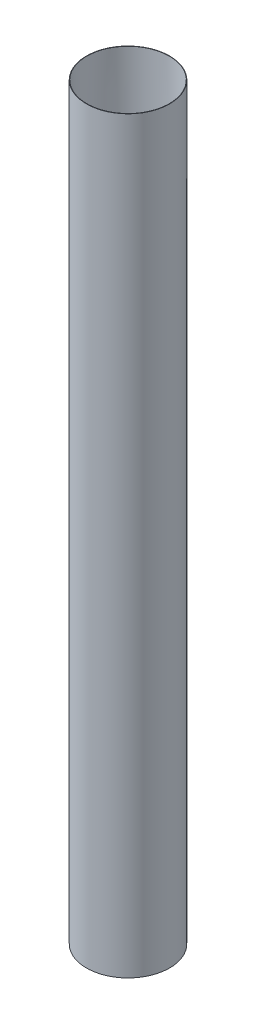
ISO-10303-21;
HEADER;
FILE_DESCRIPTION(('STEP AP214'),'2;1');
FILE_NAME('part.step','',(''),(''),'','','');
FILE_SCHEMA(('AUTOMOTIVE_DESIGN { 1 0 10303 214 1 1 1 1 }'));
ENDSEC;
DATA;
#1=APPLICATION_CONTEXT('core data for automotive mechanical design processes');
#2=APPLICATION_PROTOCOL_DEFINITION('international standard','automotive_design',2000,#1);
#3=PRODUCT_CONTEXT('',#1,'mechanical');
#4=PRODUCT('Part','Part','',(#3));
#5=PRODUCT_RELATED_PRODUCT_CATEGORY('part','',(#4));
#6=PRODUCT_DEFINITION_FORMATION('','',#4);
#7=PRODUCT_DEFINITION_CONTEXT('part definition',#1,'design');
#8=PRODUCT_DEFINITION('design','',#6,#7);
#9=PRODUCT_DEFINITION_SHAPE('','',#8);
#10=(LENGTH_UNIT() NAMED_UNIT(*) SI_UNIT(.MILLI.,.METRE.));
#11=(NAMED_UNIT(*) PLANE_ANGLE_UNIT() SI_UNIT($,.RADIAN.));
#12=(NAMED_UNIT(*) SI_UNIT($,.STERADIAN.) SOLID_ANGLE_UNIT());
#13=UNCERTAINTY_MEASURE_WITH_UNIT(LENGTH_MEASURE(1.E-05),#10,'distance_accuracy_value','');
#14=(GEOMETRIC_REPRESENTATION_CONTEXT(3) GLOBAL_UNCERTAINTY_ASSIGNED_CONTEXT((#13)) GLOBAL_UNIT_ASSIGNED_CONTEXT((#10,
#11,#12)) REPRESENTATION_CONTEXT('',''));
#15=CARTESIAN_POINT('',(0.,0.,0.));
#16=DIRECTION('',(0.,0.,1.));
#17=DIRECTION('',(1.,0.,0.));
#18=AXIS2_PLACEMENT_3D('',#15,#16,#17);
#19=CARTESIAN_POINT('',(0.,90000.,0.));
#20=DIRECTION('',(0.,1.,0.));
#21=DIRECTION('',(0.,0.,1.));
#22=AXIS2_PLACEMENT_3D('',#19,#20,#21);
#23=CONICAL_SURFACE('',#22,4959.,0.000155555554300862);
#24=CARTESIAN_POINT('',(0.,0.,0.));
#25=DIRECTION('',(0.,-1.,0.));
#26=DIRECTION('',(0.,0.,-1.));
#27=AXIS2_PLACEMENT_3D('',#24,#25,#26);
#28=CIRCLE('',#27,4945.);
#29=CARTESIAN_POINT('',(0.,0.,-4945.));
#30=VERTEX_POINT('',#29);
#31=EDGE_CURVE('E10',#30,#30,#28,.T.);
#32=ORIENTED_EDGE('',*,*,#31,.T.);
#33=EDGE_LOOP('',(#32));
#34=FACE_BOUND('',#33,.T.);
#35=CARTESIAN_POINT('',(0.,90000.,0.));
#36=DIRECTION('',(0.,-1.,0.));
#37=DIRECTION('',(0.,0.,-1.));
#38=AXIS2_PLACEMENT_3D('',#35,#36,#37);
#39=CIRCLE('',#38,4959.);
#40=CARTESIAN_POINT('',(0.,90000.,-4959.));
#41=VERTEX_POINT('',#40);
#42=EDGE_CURVE('E49',#41,#41,#39,.T.);
#43=ORIENTED_EDGE('',*,*,#42,.F.);
#44=EDGE_LOOP('',(#43));
#45=FACE_BOUND('',#44,.T.);
#46=ADVANCED_FACE('F35',(#34,#45),#23,.F.);
#47=CARTESIAN_POINT('',(4945.,0.,0.));
#48=DIRECTION('',(0.,-1.,0.));
#49=DIRECTION('',(0.,0.,-1.));
#50=AXIS2_PLACEMENT_3D('',#47,#48,#49);
#51=PLANE('',#50);
#52=CARTESIAN_POINT('',(0.,0.,0.));
#53=DIRECTION('',(0.,-1.,0.));
#54=DIRECTION('',(0.,0.,-1.));
#55=AXIS2_PLACEMENT_3D('',#52,#53,#54);
#56=CIRCLE('',#55,5000.);
#57=CARTESIAN_POINT('',(0.,0.,-5000.));
#58=VERTEX_POINT('',#57);
#59=EDGE_CURVE('E41',#58,#58,#56,.T.);
#60=ORIENTED_EDGE('',*,*,#59,.T.);
#61=EDGE_LOOP('',(#60));
#62=FACE_BOUND('',#61,.T.);
#63=ORIENTED_EDGE('',*,*,#31,.F.);
#64=EDGE_LOOP('',(#63));
#65=FACE_BOUND('',#64,.T.);
#66=ADVANCED_FACE('F59',(#62,#65),#51,.T.);
#67=CARTESIAN_POINT('',(0.,0.,0.));
#68=DIRECTION('',(0.,-1.,0.));
#69=DIRECTION('',(0.,0.,-1.));
#70=AXIS2_PLACEMENT_3D('',#67,#68,#69);
#71=CYLINDRICAL_SURFACE('',#70,5000.);
#72=CARTESIAN_POINT('',(0.,90000.,0.));
#73=DIRECTION('',(0.,-1.,0.));
#74=DIRECTION('',(0.,0.,-1.));
#75=AXIS2_PLACEMENT_3D('',#72,#73,#74);
#76=CIRCLE('',#75,5000.);
#77=CARTESIAN_POINT('',(0.,90000.,-5000.));
#78=VERTEX_POINT('',#77);
#79=EDGE_CURVE('E45',#78,#78,#76,.T.);
#80=ORIENTED_EDGE('',*,*,#79,.T.);
#81=EDGE_LOOP('',(#80));
#82=FACE_BOUND('',#81,.T.);
#83=ORIENTED_EDGE('',*,*,#59,.F.);
#84=EDGE_LOOP('',(#83));
#85=FACE_BOUND('',#84,.T.);
#86=ADVANCED_FACE('F63',(#82,#85),#71,.T.);
#87=CARTESIAN_POINT('',(4959.,90000.,0.));
#88=DIRECTION('',(0.,1.,0.));
#89=DIRECTION('',(0.,0.,1.));
#90=AXIS2_PLACEMENT_3D('',#87,#88,#89);
#91=PLANE('',#90);
#92=ORIENTED_EDGE('',*,*,#42,.T.);
#93=EDGE_LOOP('',(#92));
#94=FACE_BOUND('',#93,.T.);
#95=ORIENTED_EDGE('',*,*,#79,.F.);
#96=EDGE_LOOP('',(#95));
#97=FACE_BOUND('',#96,.T.);
#98=ADVANCED_FACE('F55',(#94,#97),#91,.T.);
#99=CLOSED_SHELL('',(#46,#66,#86,#98));
#100=MANIFOLD_SOLID_BREP('B2',#99);
#101=ADVANCED_BREP_SHAPE_REPRESENTATION('',(#18,#100),#14);
#102=SHAPE_DEFINITION_REPRESENTATION(#9,#101);
ENDSEC;
END-ISO-10303-21;
